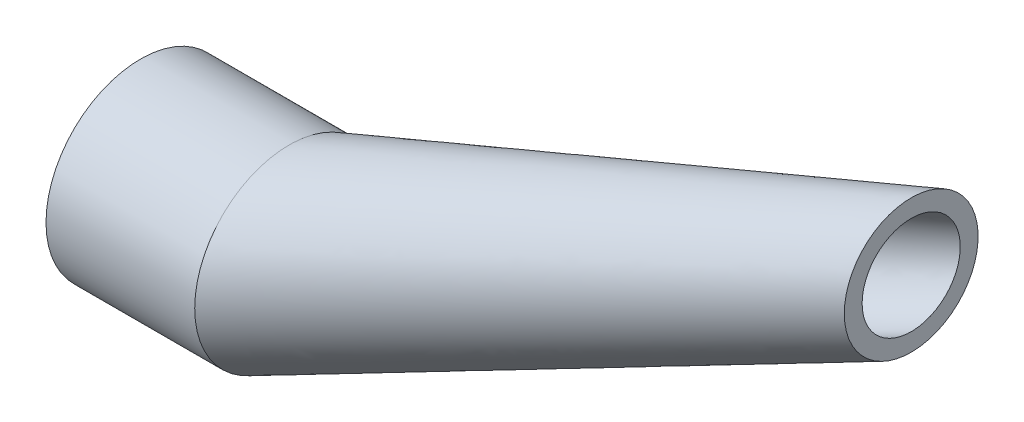
ISO-10303-21;
HEADER;
FILE_DESCRIPTION(('STEP AP214'),'2;1');
FILE_NAME('part.step','',(''),(''),'','','');
FILE_SCHEMA(('AUTOMOTIVE_DESIGN { 1 0 10303 214 1 1 1 1 }'));
ENDSEC;
DATA;
#1=APPLICATION_CONTEXT('core data for automotive mechanical design processes');
#2=APPLICATION_PROTOCOL_DEFINITION('international standard','automotive_design',2000,#1);
#3=PRODUCT_CONTEXT('',#1,'mechanical');
#4=PRODUCT('Part','Part','',(#3));
#5=PRODUCT_RELATED_PRODUCT_CATEGORY('part','',(#4));
#6=PRODUCT_DEFINITION_FORMATION('','',#4);
#7=PRODUCT_DEFINITION_CONTEXT('part definition',#1,'design');
#8=PRODUCT_DEFINITION('design','',#6,#7);
#9=PRODUCT_DEFINITION_SHAPE('','',#8);
#10=(LENGTH_UNIT() NAMED_UNIT(*) SI_UNIT(.MILLI.,.METRE.));
#11=(NAMED_UNIT(*) PLANE_ANGLE_UNIT() SI_UNIT($,.RADIAN.));
#12=(NAMED_UNIT(*) SI_UNIT($,.STERADIAN.) SOLID_ANGLE_UNIT());
#13=UNCERTAINTY_MEASURE_WITH_UNIT(LENGTH_MEASURE(1.E-05),#10,'distance_accuracy_value','');
#14=(GEOMETRIC_REPRESENTATION_CONTEXT(3) GLOBAL_UNCERTAINTY_ASSIGNED_CONTEXT((#13)) GLOBAL_UNIT_ASSIGNED_CONTEXT((#10,
#11,#12)) REPRESENTATION_CONTEXT('',''));
#15=CARTESIAN_POINT('',(0.,0.,0.));
#16=DIRECTION('',(0.,0.,1.));
#17=DIRECTION('',(1.,0.,0.));
#18=AXIS2_PLACEMENT_3D('',#15,#16,#17);
#19=CARTESIAN_POINT('',(104.,6.854756208915,16.301881790475));
#20=CARTESIAN_POINT('',(118.7,10.483647422994,9.337206040581));
#21=CARTESIAN_POINT('',(103.99999999999,5.69478353682,16.301881790474));
#22=CARTESIAN_POINT('',(118.69999999999,9.68616621093,9.337206040581));
#23=CARTESIAN_POINT('',(104.00000000003,4.534810400868,15.694518186883));
#24=CARTESIAN_POINT('',(118.70000000004,8.888684679958,8.919643563108));
#25=CARTESIAN_POINT('',(103.99999999989,3.721765970679,14.479827138878));
#26=CARTESIAN_POINT('',(118.69999999988,8.329716634219,8.084543467617));
#27=CARTESIAN_POINT('',(104.00000000019,3.602536382208,12.87559095855));
#28=CARTESIAN_POINT('',(118.70000000023,8.24774629211,6.981631093614));
#29=CARTESIAN_POINT('',(103.99999999972,4.372031387137,11.318470808253));
#30=CARTESIAN_POINT('',(118.69999999967,8.776774108059,5.911110990331));
#31=CARTESIAN_POINT('',(104.00000000029,5.920081795076,10.341001839447));
#32=CARTESIAN_POINT('',(118.70000000034,9.841058763432,5.239101074214));
#33=CARTESIAN_POINT('',(103.99999999976,7.789430622759,10.341001839341));
#34=CARTESIAN_POINT('',(118.69999999972,11.126236082565,5.239101074211));
#35=CARTESIAN_POINT('',(104.00000000014,9.337481030681,11.318470808338));
#36=CARTESIAN_POINT('',(118.70000000015,12.190520737913,5.911110990334));
#37=CARTESIAN_POINT('',(103.99999999993,10.106976035634,12.875590958496));
#38=CARTESIAN_POINT('',(118.69999999993,12.719548553896,6.981631093612));
#39=CARTESIAN_POINT('',(104.00000000002,9.987746447143,14.479827138904));
#40=CARTESIAN_POINT('',(118.70000000001,12.637578211759,8.084543467617));
#41=CARTESIAN_POINT('',(103.99999999999,9.174702016965,15.694518186874));
#42=CARTESIAN_POINT('',(118.69999999999,12.078610166035,8.919643563108));
#43=CARTESIAN_POINT('',(104.,8.014728881009,16.301881790476));
#44=CARTESIAN_POINT('',(118.7,11.281128635058,9.337206040581));
#45=CARTESIAN_POINT('',(104.,6.854756208915,16.301881790475));
#46=CARTESIAN_POINT('',(118.7,10.483647422994,9.337206040581));
#47=(BOUNDED_SURFACE() B_SPLINE_SURFACE(13,1,((#19,#20),(#21,#22),(#23,#24),(#25,#26),(#27,#28),
(#29,#30),(#31,#32),(#33,#34),(#35,#36),(#37,#38),(#39,#40),(#41,#42),(#43,#44),(#45,#46)),
.UNSPECIFIED.,.T.,.F.,.F.) B_SPLINE_SURFACE_WITH_KNOTS((14,14),(2,2),(0.,6.28318530718),(0.,1.),
.UNSPECIFIED.) GEOMETRIC_REPRESENTATION_ITEM() RATIONAL_B_SPLINE_SURFACE(((1.,1.),(1.,1.),(1.,
1.),(1.,1.),(1.,1.),(1.,1.),(1.,1.),(1.,1.),(1.,1.),(1.,1.),(1.,1.),(1.,1.),(1.,1.),(1.,1.))) REPRESENTATION_ITEM('') SURFACE());
#48=CARTESIAN_POINT('',(104.,6.854756208915,16.301881790475));
#49=CARTESIAN_POINT('',(118.7,10.483647422994,9.337206040581));
#50=(BOUNDED_CURVE() B_SPLINE_CURVE(1,(#48,#49),.UNSPECIFIED.,.F.,
.F.) B_SPLINE_CURVE_WITH_KNOTS((2,2),(0.,1.),
.UNSPECIFIED.) CURVE() GEOMETRIC_REPRESENTATION_ITEM() RATIONAL_B_SPLINE_CURVE((1.,1.)) REPRESENTATION_ITEM(''));
#51=CARTESIAN_POINT('',(104.,6.854756208915,16.301881790475));
#52=VERTEX_POINT('',#51);
#53=CARTESIAN_POINT('',(118.7,10.483647422994,9.337206040581));
#54=VERTEX_POINT('',#53);
#55=EDGE_CURVE('E11',#52,#54,#50,.T.);
#56=CARTESIAN_POINT('',(118.7,10.483647422994,7.687206040581));
#57=DIRECTION('',(1.,0.,0.));
#58=DIRECTION('',(0.,0.,1.));
#59=AXIS2_PLACEMENT_3D('',#56,#57,#58);
#60=CIRCLE('',#59,1.65);
#61=EDGE_CURVE('E29',#54,#54,#60,.T.);
#62=CARTESIAN_POINT('',(104.,6.854756208915,13.901881790475));
#63=DIRECTION('',(1.,0.,0.));
#64=DIRECTION('',(0.,0.,1.));
#65=AXIS2_PLACEMENT_3D('',#62,#63,#64);
#66=CIRCLE('',#65,2.4);
#67=EDGE_CURVE('E83',#52,#52,#66,.T.);
#68=ORIENTED_EDGE('',*,*,#55,.T.);
#69=ORIENTED_EDGE('',*,*,#61,.T.);
#70=ORIENTED_EDGE('',*,*,#55,.F.);
#71=ORIENTED_EDGE('',*,*,#67,.F.);
#72=EDGE_LOOP('',(#68,#69,#70,#71));
#73=FACE_BOUND('',#72,.T.);
#74=ADVANCED_FACE('F17',(#73),#47,.F.);
#75=CARTESIAN_POINT('',(118.7,10.483647422994,7.687206040581));
#76=DIRECTION('',(1.,0.,0.));
#77=DIRECTION('',(0.,1.,0.));
#78=AXIS2_PLACEMENT_3D('',#75,#76,#77);
#79=PLANE('',#78);
#80=ORIENTED_EDGE('',*,*,#61,.F.);
#81=EDGE_LOOP('',(#80));
#82=FACE_BOUND('',#81,.T.);
#83=CARTESIAN_POINT('',(118.7,10.483647422994,7.687206040581));
#84=DIRECTION('',(1.,0.,0.));
#85=DIRECTION('',(0.,0.,1.));
#86=AXIS2_PLACEMENT_3D('',#83,#84,#85);
#87=CIRCLE('',#86,2.25);
#88=CARTESIAN_POINT('',(118.7,10.483647422994,9.937206040581));
#89=VERTEX_POINT('',#88);
#90=EDGE_CURVE('E22',#89,#89,#87,.T.);
#91=ORIENTED_EDGE('',*,*,#90,.T.);
#92=EDGE_LOOP('',(#91));
#93=FACE_BOUND('',#92,.T.);
#94=ADVANCED_FACE('F77',(#82,#93),#79,.T.);
#95=CARTESIAN_POINT('',(99.,6.854756208915,13.901881790475));
#96=DIRECTION('',(1.,0.,0.));
#97=DIRECTION('',(0.,0.,1.));
#98=AXIS2_PLACEMENT_3D('',#95,#96,#97);
#99=CYLINDRICAL_SURFACE('',#98,2.4);
#100=CARTESIAN_POINT('',(99.,6.854756208915,16.301881790475));
#101=CARTESIAN_POINT('',(104.,6.854756208915,16.301881790475));
#102=(BOUNDED_CURVE() B_SPLINE_CURVE(1,(#100,#101),.UNSPECIFIED.,.F.,
.F.) B_SPLINE_CURVE_WITH_KNOTS((2,2),(0.,1.),
.UNSPECIFIED.) CURVE() GEOMETRIC_REPRESENTATION_ITEM() RATIONAL_B_SPLINE_CURVE((1.,1.)) REPRESENTATION_ITEM(''));
#103=CARTESIAN_POINT('',(99.,6.854756208915,16.301881790475));
#104=VERTEX_POINT('',#103);
#105=EDGE_CURVE('E72',#104,#52,#102,.T.);
#106=ORIENTED_EDGE('',*,*,#105,.T.);
#107=ORIENTED_EDGE('',*,*,#67,.T.);
#108=ORIENTED_EDGE('',*,*,#105,.F.);
#109=CARTESIAN_POINT('',(99.,6.854756208915,13.901881790475));
#110=DIRECTION('',(1.,0.,0.));
#111=DIRECTION('',(0.,0.,1.));
#112=AXIS2_PLACEMENT_3D('',#109,#110,#111);
#113=CIRCLE('',#112,2.4);
#114=EDGE_CURVE('E86',#104,#104,#113,.T.);
#115=ORIENTED_EDGE('',*,*,#114,.F.);
#116=EDGE_LOOP('',(#106,#107,#108,#115));
#117=FACE_BOUND('',#116,.T.);
#118=ADVANCED_FACE('F122',(#117),#99,.F.);
#119=CARTESIAN_POINT('',(104.,6.854756208915,17.076881790475));
#120=CARTESIAN_POINT('',(118.7,10.483647422994,9.937206040581));
#121=CARTESIAN_POINT('',(103.99999999999,5.320209028123,17.076881790474));
#122=CARTESIAN_POINT('',(118.69999999999,9.396173042906,9.937206040581));
#123=CARTESIAN_POINT('',(104.00000000003,3.785661233687,16.273390356551));
#124=CARTESIAN_POINT('',(118.70000000004,8.308698227949,9.367802662208));
#125=CARTESIAN_POINT('',(103.99999999989,2.710071206249,14.666455324313));
#126=CARTESIAN_POINT('',(118.69999999988,7.546469074653,8.229029804721));
#127=CARTESIAN_POINT('',(104.00000000019,2.552340396501,12.544184544046));
#128=CARTESIAN_POINT('',(118.70000000023,7.434691335449,6.725058385624));
#129=CARTESIAN_POINT('',(103.99999999972,3.570318163437,10.484244345285));
#130=CARTESIAN_POINT('',(118.69999999967,8.156092902589,5.265258244789));
#131=CARTESIAN_POINT('',(104.00000000029,5.618259848942,9.191134355211));
#132=CARTESIAN_POINT('',(118.70000000034,9.607390160006,4.348881086441));
#133=CARTESIAN_POINT('',(103.99999999976,8.091252568894,9.19113435517));
#134=CARTESIAN_POINT('',(118.69999999972,11.359904685988,4.348881086444));
#135=CARTESIAN_POINT('',(104.00000000014,10.139194254379,10.484244345317));
#136=CARTESIAN_POINT('',(118.70000000015,12.811201943389,5.265258244785));
#137=CARTESIAN_POINT('',(103.99999999993,11.157172021344,12.544184544028));
#138=CARTESIAN_POINT('',(118.69999999993,13.532603510551,6.725058385628));
#139=CARTESIAN_POINT('',(104.00000000002,10.999441211571,14.666455324321));
#140=CARTESIAN_POINT('',(118.70000000001,13.42082577133,8.229029804719));
#141=CARTESIAN_POINT('',(103.99999999999,9.923851184147,16.273390356548));
#142=CARTESIAN_POINT('',(118.69999999999,12.658596618042,9.367802662209));
#143=CARTESIAN_POINT('',(104.,8.389303389706,17.076881790475));
#144=CARTESIAN_POINT('',(118.7,11.571121803082,9.93720604058));
#145=CARTESIAN_POINT('',(104.,6.854756208915,17.076881790475));
#146=CARTESIAN_POINT('',(118.7,10.483647422994,9.937206040581));
#147=(BOUNDED_SURFACE() B_SPLINE_SURFACE(13,1,((#119,#120),(#121,#122),(#123,#124),(#125,#126),
(#127,#128),(#129,#130),(#131,#132),(#133,#134),(#135,#136),(#137,#138),(#139,#140),(#141,#142),
(#143,#144),(#145,#146)),.UNSPECIFIED.,.T.,.F.,.F.) B_SPLINE_SURFACE_WITH_KNOTS((14,14),(2,2),
(0.,6.28318530718),(0.,1.),
.UNSPECIFIED.) GEOMETRIC_REPRESENTATION_ITEM() RATIONAL_B_SPLINE_SURFACE(((1.,1.),(1.,1.),(1.,
1.),(1.,1.),(1.,1.),(1.,1.),(1.,1.),(1.,1.),(1.,1.),(1.,1.),(1.,1.),(1.,1.),(1.,1.),(1.,1.))) REPRESENTATION_ITEM('') SURFACE());
#148=CARTESIAN_POINT('',(104.,6.854756208915,13.901881790475));
#149=DIRECTION('',(1.,0.,0.));
#150=DIRECTION('',(0.,0.,1.));
#151=AXIS2_PLACEMENT_3D('',#148,#149,#150);
#152=CIRCLE('',#151,3.175);
#153=CARTESIAN_POINT('',(104.,6.854756208915,17.076881790475));
#154=VERTEX_POINT('',#153);
#155=EDGE_CURVE('E90',#154,#154,#152,.T.);
#156=CARTESIAN_POINT('',(104.,6.854756208915,17.076881790475));
#157=CARTESIAN_POINT('',(118.7,10.483647422994,9.937206040581));
#158=(BOUNDED_CURVE() B_SPLINE_CURVE(1,(#156,#157),.UNSPECIFIED.,.F.,
.F.) B_SPLINE_CURVE_WITH_KNOTS((2,2),(0.,1.),
.UNSPECIFIED.) CURVE() GEOMETRIC_REPRESENTATION_ITEM() RATIONAL_B_SPLINE_CURVE((1.,1.)) REPRESENTATION_ITEM(''));
#159=EDGE_CURVE('E62',#154,#89,#158,.T.);
#160=ORIENTED_EDGE('',*,*,#155,.T.);
#161=ORIENTED_EDGE('',*,*,#159,.T.);
#162=ORIENTED_EDGE('',*,*,#90,.F.);
#163=ORIENTED_EDGE('',*,*,#159,.F.);
#164=EDGE_LOOP('',(#160,#161,#162,#163));
#165=FACE_BOUND('',#164,.T.);
#166=ADVANCED_FACE('F132',(#165),#147,.T.);
#167=CARTESIAN_POINT('',(99.,6.854756208915,13.901881790475));
#168=DIRECTION('',(1.,0.,0.));
#169=DIRECTION('',(0.,1.,0.));
#170=AXIS2_PLACEMENT_3D('',#167,#168,#169);
#171=PLANE('',#170);
#172=ORIENTED_EDGE('',*,*,#114,.T.);
#173=EDGE_LOOP('',(#172));
#174=FACE_BOUND('',#173,.T.);
#175=CARTESIAN_POINT('',(99.,6.854756208915,13.901881790475));
#176=DIRECTION('',(1.,0.,0.));
#177=DIRECTION('',(0.,0.,1.));
#178=AXIS2_PLACEMENT_3D('',#175,#176,#177);
#179=CIRCLE('',#178,3.175);
#180=CARTESIAN_POINT('',(99.,6.854756208915,17.076881790475));
#181=VERTEX_POINT('',#180);
#182=EDGE_CURVE('E97',#181,#181,#179,.T.);
#183=ORIENTED_EDGE('',*,*,#182,.F.);
#184=EDGE_LOOP('',(#183));
#185=FACE_BOUND('',#184,.T.);
#186=ADVANCED_FACE('F140',(#174,#185),#171,.F.);
#187=CARTESIAN_POINT('',(99.,6.854756208915,13.901881790475));
#188=DIRECTION('',(1.,0.,0.));
#189=DIRECTION('',(0.,0.,1.));
#190=AXIS2_PLACEMENT_3D('',#187,#188,#189);
#191=CYLINDRICAL_SURFACE('',#190,3.175);
#192=ORIENTED_EDGE('',*,*,#182,.T.);
#193=CARTESIAN_POINT('',(99.,6.854756208915,17.076881790475));
#194=CARTESIAN_POINT('',(104.,6.854756208915,17.076881790475));
#195=(BOUNDED_CURVE() B_SPLINE_CURVE(1,(#193,#194),.UNSPECIFIED.,.F.,
.F.) B_SPLINE_CURVE_WITH_KNOTS((2,2),(0.,1.),
.UNSPECIFIED.) CURVE() GEOMETRIC_REPRESENTATION_ITEM() RATIONAL_B_SPLINE_CURVE((1.,1.)) REPRESENTATION_ITEM(''));
#196=EDGE_CURVE('E53',#181,#154,#195,.T.);
#197=ORIENTED_EDGE('',*,*,#196,.T.);
#198=ORIENTED_EDGE('',*,*,#155,.F.);
#199=ORIENTED_EDGE('',*,*,#196,.F.);
#200=EDGE_LOOP('',(#192,#197,#198,#199));
#201=FACE_BOUND('',#200,.T.);
#202=ADVANCED_FACE('F135',(#201),#191,.T.);
#203=CLOSED_SHELL('',(#74,#94,#118,#166,#186,#202));
#204=MANIFOLD_SOLID_BREP('B1',#203);
#205=ADVANCED_BREP_SHAPE_REPRESENTATION('',(#18,#204),#14);
#206=SHAPE_DEFINITION_REPRESENTATION(#9,#205);
ENDSEC;
END-ISO-10303-21;
